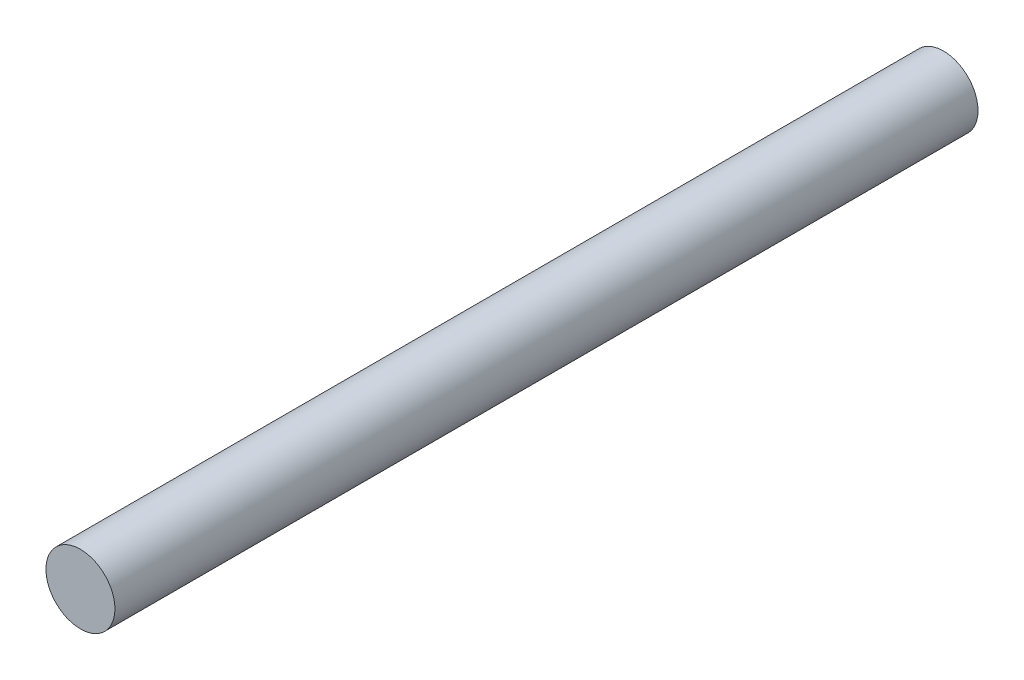
ISO-10303-21;
HEADER;
FILE_DESCRIPTION(('STEP AP214'),'2;1');
FILE_NAME('part.step','',(''),(''),'','','');
FILE_SCHEMA(('AUTOMOTIVE_DESIGN { 1 0 10303 214 1 1 1 1 }'));
ENDSEC;
DATA;
#1=APPLICATION_CONTEXT('core data for automotive mechanical design processes');
#2=APPLICATION_PROTOCOL_DEFINITION('international standard','automotive_design',2000,#1);
#3=PRODUCT_CONTEXT('',#1,'mechanical');
#4=PRODUCT('Part','Part','',(#3));
#5=PRODUCT_RELATED_PRODUCT_CATEGORY('part','',(#4));
#6=PRODUCT_DEFINITION_FORMATION('','',#4);
#7=PRODUCT_DEFINITION_CONTEXT('part definition',#1,'design');
#8=PRODUCT_DEFINITION('design','',#6,#7);
#9=PRODUCT_DEFINITION_SHAPE('','',#8);
#10=(LENGTH_UNIT() NAMED_UNIT(*) SI_UNIT(.MILLI.,.METRE.));
#11=(NAMED_UNIT(*) PLANE_ANGLE_UNIT() SI_UNIT($,.RADIAN.));
#12=(NAMED_UNIT(*) SI_UNIT($,.STERADIAN.) SOLID_ANGLE_UNIT());
#13=UNCERTAINTY_MEASURE_WITH_UNIT(LENGTH_MEASURE(1.E-05),#10,'distance_accuracy_value','');
#14=(GEOMETRIC_REPRESENTATION_CONTEXT(3) GLOBAL_UNCERTAINTY_ASSIGNED_CONTEXT((#13)) GLOBAL_UNIT_ASSIGNED_CONTEXT((#10,
#11,#12)) REPRESENTATION_CONTEXT('',''));
#15=CARTESIAN_POINT('',(0.,0.,0.));
#16=DIRECTION('',(0.,0.,1.));
#17=DIRECTION('',(1.,0.,0.));
#18=AXIS2_PLACEMENT_3D('',#15,#16,#17);
#19=CARTESIAN_POINT('',(0.,0.,158.877));
#20=DIRECTION('',(0.,0.,-1.));
#21=DIRECTION('',(-1.,0.,0.));
#22=AXIS2_PLACEMENT_3D('',#19,#20,#21);
#23=CYLINDRICAL_SURFACE('',#22,6.35);
#24=CARTESIAN_POINT('',(0.,0.,158.877));
#25=DIRECTION('',(0.,0.,1.));
#26=DIRECTION('',(1.,0.,0.));
#27=AXIS2_PLACEMENT_3D('',#24,#25,#26);
#28=CIRCLE('',#27,6.35);
#29=CARTESIAN_POINT('',(6.35,0.,158.877));
#30=VERTEX_POINT('',#29);
#31=EDGE_CURVE('E10',#30,#30,#28,.T.);
#32=ORIENTED_EDGE('',*,*,#31,.F.);
#33=EDGE_LOOP('',(#32));
#34=FACE_BOUND('',#33,.T.);
#35=CARTESIAN_POINT('',(0.,0.,0.));
#36=DIRECTION('',(0.,0.,1.));
#37=DIRECTION('',(1.,0.,0.));
#38=AXIS2_PLACEMENT_3D('',#35,#36,#37);
#39=CIRCLE('',#38,6.35);
#40=CARTESIAN_POINT('',(6.35,0.,0.));
#41=VERTEX_POINT('',#40);
#42=EDGE_CURVE('E46',#41,#41,#39,.T.);
#43=ORIENTED_EDGE('',*,*,#42,.T.);
#44=EDGE_LOOP('',(#43));
#45=FACE_BOUND('',#44,.T.);
#46=ADVANCED_FACE('F43',(#34,#45),#23,.T.);
#47=CARTESIAN_POINT('',(0.,0.,158.877));
#48=DIRECTION('',(0.,0.,1.));
#49=DIRECTION('',(1.,0.,0.));
#50=AXIS2_PLACEMENT_3D('',#47,#48,#49);
#51=PLANE('',#50);
#52=ORIENTED_EDGE('',*,*,#31,.T.);
#53=EDGE_LOOP('',(#52));
#54=FACE_BOUND('',#53,.T.);
#55=ADVANCED_FACE('F60',(#54),#51,.T.);
#56=CARTESIAN_POINT('',(0.,0.,0.));
#57=DIRECTION('',(0.,0.,1.));
#58=DIRECTION('',(1.,0.,0.));
#59=AXIS2_PLACEMENT_3D('',#56,#57,#58);
#60=PLANE('',#59);
#61=ORIENTED_EDGE('',*,*,#42,.F.);
#62=EDGE_LOOP('',(#61));
#63=FACE_BOUND('',#62,.T.);
#64=ADVANCED_FACE('F58',(#63),#60,.F.);
#65=CLOSED_SHELL('',(#46,#55,#64));
#66=MANIFOLD_SOLID_BREP('B2',#65);
#67=ADVANCED_BREP_SHAPE_REPRESENTATION('',(#18,#66),#14);
#68=SHAPE_DEFINITION_REPRESENTATION(#9,#67);
ENDSEC;
END-ISO-10303-21;
